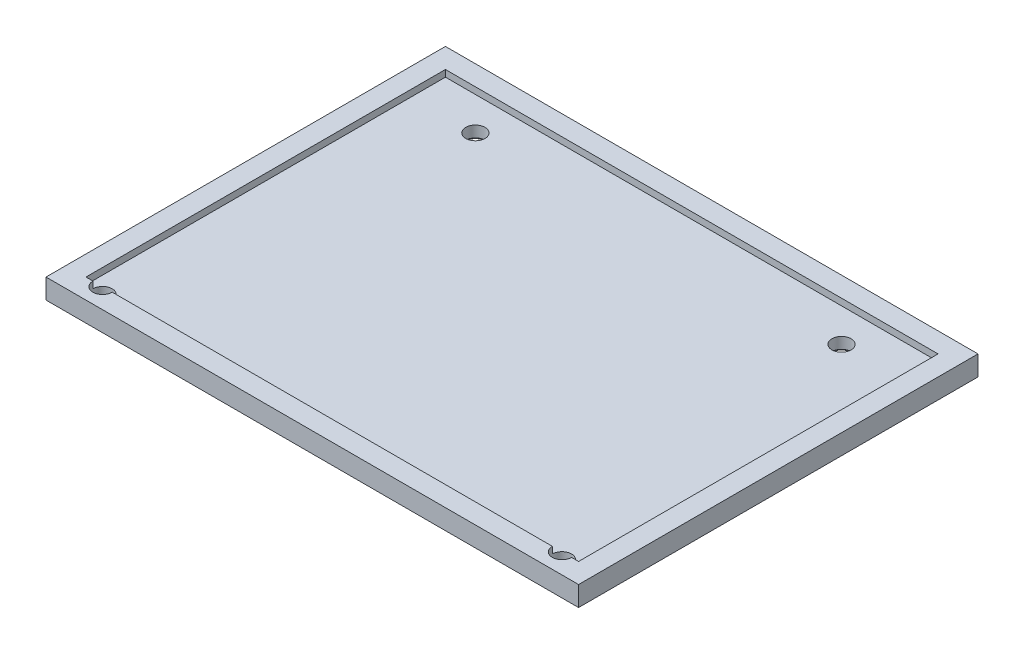
ISO-10303-21;
HEADER;
FILE_DESCRIPTION(('STEP AP214'),'2;1');
FILE_NAME('part.step','',(''),(''),'','','');
FILE_SCHEMA(('AUTOMOTIVE_DESIGN { 1 0 10303 214 1 1 1 1 }'));
ENDSEC;
DATA;
#1=APPLICATION_CONTEXT('core data for automotive mechanical design processes');
#2=APPLICATION_PROTOCOL_DEFINITION('international standard','automotive_design',2000,#1);
#3=PRODUCT_CONTEXT('',#1,'mechanical');
#4=PRODUCT('Part','Part','',(#3));
#5=PRODUCT_RELATED_PRODUCT_CATEGORY('part','',(#4));
#6=PRODUCT_DEFINITION_FORMATION('','',#4);
#7=PRODUCT_DEFINITION_CONTEXT('part definition',#1,'design');
#8=PRODUCT_DEFINITION('design','',#6,#7);
#9=PRODUCT_DEFINITION_SHAPE('','',#8);
#10=(LENGTH_UNIT() NAMED_UNIT(*) SI_UNIT(.MILLI.,.METRE.));
#11=(NAMED_UNIT(*) PLANE_ANGLE_UNIT() SI_UNIT($,.RADIAN.));
#12=(NAMED_UNIT(*) SI_UNIT($,.STERADIAN.) SOLID_ANGLE_UNIT());
#13=UNCERTAINTY_MEASURE_WITH_UNIT(LENGTH_MEASURE(1.E-05),#10,'distance_accuracy_value','');
#14=(GEOMETRIC_REPRESENTATION_CONTEXT(3) GLOBAL_UNCERTAINTY_ASSIGNED_CONTEXT((#13)) GLOBAL_UNIT_ASSIGNED_CONTEXT((#10,
#11,#12)) REPRESENTATION_CONTEXT('',''));
#15=CARTESIAN_POINT('',(0.,0.,0.));
#16=DIRECTION('',(0.,0.,1.));
#17=DIRECTION('',(1.,0.,0.));
#18=AXIS2_PLACEMENT_3D('',#15,#16,#17);
#19=CARTESIAN_POINT('',(0.,3.,-3.));
#20=DIRECTION('',(0.,0.,-1.));
#21=DIRECTION('',(-1.,0.,0.));
#22=AXIS2_PLACEMENT_3D('',#19,#20,#21);
#23=PLANE('',#22);
#24=DIRECTION('',(0.,-1.,0.));
#25=VECTOR('',#24,1.);
#26=CARTESIAN_POINT('',(75.95,0.,-3.));
#27=LINE('',#26,#25);
#28=CARTESIAN_POINT('',(75.95,3.,-3.));
#29=VERTEX_POINT('',#28);
#30=CARTESIAN_POINT('',(75.95,2.,-3.));
#31=VERTEX_POINT('',#30);
#32=EDGE_CURVE('E61',#29,#31,#27,.T.);
#33=ORIENTED_EDGE('',*,*,#32,.F.);
#34=DIRECTION('',(1.,0.,0.));
#35=VECTOR('',#34,1.);
#36=CARTESIAN_POINT('',(0.,3.,-3.));
#37=LINE('',#36,#35);
#38=CARTESIAN_POINT('',(77.,3.,-3.));
#39=VERTEX_POINT('',#38);
#40=EDGE_CURVE('E283',#29,#39,#37,.T.);
#41=ORIENTED_EDGE('',*,*,#40,.T.);
#42=DIRECTION('',(0.,-1.,0.));
#43=VECTOR('',#42,1.);
#44=CARTESIAN_POINT('',(77.,3.,-3.));
#45=LINE('',#44,#43);
#46=CARTESIAN_POINT('',(77.,2.,-3.));
#47=VERTEX_POINT('',#46);
#48=EDGE_CURVE('E177',#39,#47,#45,.T.);
#49=ORIENTED_EDGE('',*,*,#48,.T.);
#50=DIRECTION('',(1.,0.,0.));
#51=VECTOR('',#50,1.);
#52=CARTESIAN_POINT('',(0.,2.,-3.));
#53=LINE('',#52,#51);
#54=EDGE_CURVE('E154',#31,#47,#53,.T.);
#55=ORIENTED_EDGE('',*,*,#54,.F.);
#56=EDGE_LOOP('',(#33,#41,#49,#55));
#57=FACE_BOUND('',#56,.T.);
#58=ADVANCED_FACE('F45',(#57),#23,.T.);
#59=DIRECTION('',(0.,-1.,0.));
#60=VECTOR('',#59,1.);
#61=CARTESIAN_POINT('',(73.05,0.,-3.));
#62=LINE('',#61,#60);
#63=CARTESIAN_POINT('',(73.05,2.,-3.));
#64=VERTEX_POINT('',#63);
#65=CARTESIAN_POINT('',(73.05,3.,-3.));
#66=VERTEX_POINT('',#65);
#67=EDGE_CURVE('E134',#64,#66,#62,.F.);
#68=ORIENTED_EDGE('',*,*,#67,.F.);
#69=CARTESIAN_POINT('',(6.94999999999999,2.,-3.));
#70=VERTEX_POINT('',#69);
#71=EDGE_CURVE('E144',#70,#64,#53,.T.);
#72=ORIENTED_EDGE('',*,*,#71,.F.);
#73=DIRECTION('',(0.,-1.,0.));
#74=VECTOR('',#73,1.);
#75=CARTESIAN_POINT('',(6.94999999999999,0.,-3.));
#76=LINE('',#75,#74);
#77=CARTESIAN_POINT('',(6.94999999999999,3.,-3.));
#78=VERTEX_POINT('',#77);
#79=EDGE_CURVE('E54',#78,#70,#76,.T.);
#80=ORIENTED_EDGE('',*,*,#79,.F.);
#81=EDGE_CURVE('E146',#78,#66,#37,.T.);
#82=ORIENTED_EDGE('',*,*,#81,.T.);
#83=EDGE_LOOP('',(#68,#72,#80,#82));
#84=FACE_BOUND('',#83,.T.);
#85=ADVANCED_FACE('F142',(#84),#23,.T.);
#86=CARTESIAN_POINT('',(0.,2.,0.));
#87=DIRECTION('',(1.,0.,0.));
#88=DIRECTION('',(0.,0.,-1.));
#89=AXIS2_PLACEMENT_3D('',#86,#87,#88);
#90=PLANE('',#89);
#91=DIRECTION('',(0.,0.,1.));
#92=VECTOR('',#91,1.);
#93=CARTESIAN_POINT('',(0.,0.,0.));
#94=LINE('',#93,#92);
#95=CARTESIAN_POINT('',(0.,0.,-60.));
#96=VERTEX_POINT('',#95);
#97=CARTESIAN_POINT('',(0.,0.,0.));
#98=VERTEX_POINT('',#97);
#99=EDGE_CURVE('E184',#96,#98,#94,.T.);
#100=ORIENTED_EDGE('',*,*,#99,.T.);
#101=DIRECTION('',(0.,-1.,0.));
#102=VECTOR('',#101,1.);
#103=CARTESIAN_POINT('',(0.,2.,0.));
#104=LINE('',#103,#102);
#105=CARTESIAN_POINT('',(0.,3.,0.));
#106=VERTEX_POINT('',#105);
#107=EDGE_CURVE('E209',#106,#98,#104,.T.);
#108=ORIENTED_EDGE('',*,*,#107,.F.);
#109=DIRECTION('',(0.,0.,1.));
#110=VECTOR('',#109,1.);
#111=CARTESIAN_POINT('',(0.,3.,0.));
#112=LINE('',#111,#110);
#113=CARTESIAN_POINT('',(0.,3.,-60.));
#114=VERTEX_POINT('',#113);
#115=EDGE_CURVE('E264',#114,#106,#112,.T.);
#116=ORIENTED_EDGE('',*,*,#115,.F.);
#117=DIRECTION('',(0.,-1.,0.));
#118=VECTOR('',#117,1.);
#119=CARTESIAN_POINT('',(0.,2.,-60.));
#120=LINE('',#119,#118);
#121=EDGE_CURVE('E197',#114,#96,#120,.T.);
#122=ORIENTED_EDGE('',*,*,#121,.T.);
#123=EDGE_LOOP('',(#100,#108,#116,#122));
#124=FACE_BOUND('',#123,.T.);
#125=ADVANCED_FACE('F47',(#124),#90,.F.);
#126=CARTESIAN_POINT('',(0.,2.,0.));
#127=DIRECTION('',(0.,0.,-1.));
#128=DIRECTION('',(-1.,0.,0.));
#129=AXIS2_PLACEMENT_3D('',#126,#127,#128);
#130=PLANE('',#129);
#131=DIRECTION('',(1.,0.,0.));
#132=VECTOR('',#131,1.);
#133=CARTESIAN_POINT('',(0.,0.,0.));
#134=LINE('',#133,#132);
#135=CARTESIAN_POINT('',(80.,0.,0.));
#136=VERTEX_POINT('',#135);
#137=EDGE_CURVE('E188',#98,#136,#134,.T.);
#138=ORIENTED_EDGE('',*,*,#137,.T.);
#139=DIRECTION('',(0.,-1.,0.));
#140=VECTOR('',#139,1.);
#141=CARTESIAN_POINT('',(80.,2.,0.));
#142=LINE('',#141,#140);
#143=CARTESIAN_POINT('',(80.,3.,0.));
#144=VERTEX_POINT('',#143);
#145=EDGE_CURVE('E205',#144,#136,#142,.T.);
#146=ORIENTED_EDGE('',*,*,#145,.F.);
#147=DIRECTION('',(1.,0.,0.));
#148=VECTOR('',#147,1.);
#149=CARTESIAN_POINT('',(0.,3.,0.));
#150=LINE('',#149,#148);
#151=EDGE_CURVE('E267',#106,#144,#150,.T.);
#152=ORIENTED_EDGE('',*,*,#151,.F.);
#153=ORIENTED_EDGE('',*,*,#107,.T.);
#154=EDGE_LOOP('',(#138,#146,#152,#153));
#155=FACE_BOUND('',#154,.T.);
#156=ADVANCED_FACE('F529',(#155),#130,.F.);
#157=CARTESIAN_POINT('',(80.,2.,0.));
#158=DIRECTION('',(-1.,0.,0.));
#159=DIRECTION('',(0.,0.,1.));
#160=AXIS2_PLACEMENT_3D('',#157,#158,#159);
#161=PLANE('',#160);
#162=DIRECTION('',(0.,0.,-1.));
#163=VECTOR('',#162,1.);
#164=CARTESIAN_POINT('',(80.,0.,0.));
#165=LINE('',#164,#163);
#166=CARTESIAN_POINT('',(80.,0.,-60.));
#167=VERTEX_POINT('',#166);
#168=EDGE_CURVE('E191',#136,#167,#165,.T.);
#169=ORIENTED_EDGE('',*,*,#168,.T.);
#170=DIRECTION('',(0.,-1.,0.));
#171=VECTOR('',#170,1.);
#172=CARTESIAN_POINT('',(80.,2.,-60.));
#173=LINE('',#172,#171);
#174=CARTESIAN_POINT('',(80.,3.,-60.));
#175=VERTEX_POINT('',#174);
#176=EDGE_CURVE('E201',#175,#167,#173,.T.);
#177=ORIENTED_EDGE('',*,*,#176,.F.);
#178=DIRECTION('',(0.,0.,-1.));
#179=VECTOR('',#178,1.);
#180=CARTESIAN_POINT('',(80.,3.,0.));
#181=LINE('',#180,#179);
#182=EDGE_CURVE('E271',#144,#175,#181,.T.);
#183=ORIENTED_EDGE('',*,*,#182,.F.);
#184=ORIENTED_EDGE('',*,*,#145,.T.);
#185=EDGE_LOOP('',(#169,#177,#183,#184));
#186=FACE_BOUND('',#185,.T.);
#187=ADVANCED_FACE('F514',(#186),#161,.F.);
#188=CARTESIAN_POINT('',(0.,2.,-60.));
#189=DIRECTION('',(0.,0.,1.));
#190=DIRECTION('',(1.,0.,0.));
#191=AXIS2_PLACEMENT_3D('',#188,#189,#190);
#192=PLANE('',#191);
#193=DIRECTION('',(-1.,0.,0.));
#194=VECTOR('',#193,1.);
#195=CARTESIAN_POINT('',(0.,0.,-60.));
#196=LINE('',#195,#194);
#197=EDGE_CURVE('E194',#167,#96,#196,.T.);
#198=ORIENTED_EDGE('',*,*,#197,.T.);
#199=ORIENTED_EDGE('',*,*,#121,.F.);
#200=DIRECTION('',(-1.,0.,0.));
#201=VECTOR('',#200,1.);
#202=CARTESIAN_POINT('',(0.,3.,-60.));
#203=LINE('',#202,#201);
#204=EDGE_CURVE('E168',#175,#114,#203,.T.);
#205=ORIENTED_EDGE('',*,*,#204,.F.);
#206=ORIENTED_EDGE('',*,*,#176,.T.);
#207=EDGE_LOOP('',(#198,#199,#205,#206));
#208=FACE_BOUND('',#207,.T.);
#209=ADVANCED_FACE('F319',(#208),#192,.F.);
#210=CARTESIAN_POINT('',(0.,0.,0.));
#211=DIRECTION('',(0.,-1.,0.));
#212=DIRECTION('',(0.,0.,-1.));
#213=AXIS2_PLACEMENT_3D('',#210,#211,#212);
#214=PLANE('',#213);
#215=CARTESIAN_POINT('',(74.5,0.,-3.));
#216=DIRECTION('',(0.,-1.,0.));
#217=DIRECTION('',(0.,0.,-1.));
#218=AXIS2_PLACEMENT_3D('',#215,#216,#217);
#219=CIRCLE('',#218,1.775);
#220=CARTESIAN_POINT('',(74.5,0.,-4.775));
#221=VERTEX_POINT('',#220);
#222=EDGE_CURVE('E613',#221,#221,#219,.T.);
#223=ORIENTED_EDGE('',*,*,#222,.F.);
#224=EDGE_LOOP('',(#223));
#225=FACE_BOUND('',#224,.T.);
#226=CARTESIAN_POINT('',(12.5,0.,-52.));
#227=DIRECTION('',(0.,-1.,0.));
#228=DIRECTION('',(0.,0.,-1.));
#229=AXIS2_PLACEMENT_3D('',#226,#227,#228);
#230=CIRCLE('',#229,1.775);
#231=CARTESIAN_POINT('',(12.5,0.,-53.775));
#232=VERTEX_POINT('',#231);
#233=EDGE_CURVE('E237',#232,#232,#230,.T.);
#234=ORIENTED_EDGE('',*,*,#233,.F.);
#235=EDGE_LOOP('',(#234));
#236=FACE_BOUND('',#235,.T.);
#237=CARTESIAN_POINT('',(67.5,0.,-52.));
#238=DIRECTION('',(0.,-1.,0.));
#239=DIRECTION('',(0.,0.,-1.));
#240=AXIS2_PLACEMENT_3D('',#237,#238,#239);
#241=CIRCLE('',#240,1.775);
#242=CARTESIAN_POINT('',(67.5,0.,-53.775));
#243=VERTEX_POINT('',#242);
#244=EDGE_CURVE('E226',#243,#243,#241,.T.);
#245=ORIENTED_EDGE('',*,*,#244,.F.);
#246=EDGE_LOOP('',(#245));
#247=FACE_BOUND('',#246,.T.);
#248=CARTESIAN_POINT('',(5.5,0.,-3.));
#249=DIRECTION('',(0.,-1.,0.));
#250=DIRECTION('',(0.,0.,-1.));
#251=AXIS2_PLACEMENT_3D('',#248,#249,#250);
#252=CIRCLE('',#251,1.775);
#253=CARTESIAN_POINT('',(5.5,0.,-4.775));
#254=VERTEX_POINT('',#253);
#255=EDGE_CURVE('E221',#254,#254,#252,.T.);
#256=ORIENTED_EDGE('',*,*,#255,.F.);
#257=EDGE_LOOP('',(#256));
#258=FACE_BOUND('',#257,.T.);
#259=ORIENTED_EDGE('',*,*,#99,.F.);
#260=ORIENTED_EDGE('',*,*,#197,.F.);
#261=ORIENTED_EDGE('',*,*,#168,.F.);
#262=ORIENTED_EDGE('',*,*,#137,.F.);
#263=EDGE_LOOP('',(#259,#260,#261,#262));
#264=FACE_BOUND('',#263,.T.);
#265=ADVANCED_FACE('F311',(#225,#236,#247,#258,#264),#214,.T.);
#266=CARTESIAN_POINT('',(0.,3.,-57.));
#267=DIRECTION('',(0.,0.,-1.));
#268=DIRECTION('',(-1.,0.,0.));
#269=AXIS2_PLACEMENT_3D('',#266,#267,#268);
#270=PLANE('',#269);
#271=DIRECTION('',(1.,0.,0.));
#272=VECTOR('',#271,1.);
#273=CARTESIAN_POINT('',(0.,2.,-57.));
#274=LINE('',#273,#272);
#275=CARTESIAN_POINT('',(3.,2.,-57.));
#276=VERTEX_POINT('',#275);
#277=CARTESIAN_POINT('',(77.,2.,-57.));
#278=VERTEX_POINT('',#277);
#279=EDGE_CURVE('E260',#276,#278,#274,.T.);
#280=ORIENTED_EDGE('',*,*,#279,.T.);
#281=DIRECTION('',(0.,-1.,0.));
#282=VECTOR('',#281,1.);
#283=CARTESIAN_POINT('',(77.,3.,-57.));
#284=LINE('',#283,#282);
#285=CARTESIAN_POINT('',(77.,3.,-57.));
#286=VERTEX_POINT('',#285);
#287=EDGE_CURVE('E181',#286,#278,#284,.T.);
#288=ORIENTED_EDGE('',*,*,#287,.F.);
#289=DIRECTION('',(1.,0.,0.));
#290=VECTOR('',#289,1.);
#291=CARTESIAN_POINT('',(0.,3.,-57.));
#292=LINE('',#291,#290);
#293=CARTESIAN_POINT('',(3.,3.,-57.));
#294=VERTEX_POINT('',#293);
#295=EDGE_CURVE('E275',#294,#286,#292,.T.);
#296=ORIENTED_EDGE('',*,*,#295,.F.);
#297=DIRECTION('',(0.,-1.,0.));
#298=VECTOR('',#297,1.);
#299=CARTESIAN_POINT('',(3.,3.,-57.));
#300=LINE('',#299,#298);
#301=EDGE_CURVE('E169',#294,#276,#300,.T.);
#302=ORIENTED_EDGE('',*,*,#301,.T.);
#303=EDGE_LOOP('',(#280,#288,#296,#302));
#304=FACE_BOUND('',#303,.T.);
#305=ADVANCED_FACE('F309',(#304),#270,.F.);
#306=CARTESIAN_POINT('',(77.,3.,0.));
#307=DIRECTION('',(1.,0.,0.));
#308=DIRECTION('',(0.,0.,-1.));
#309=AXIS2_PLACEMENT_3D('',#306,#307,#308);
#310=PLANE('',#309);
#311=DIRECTION('',(0.,0.,1.));
#312=VECTOR('',#311,1.);
#313=CARTESIAN_POINT('',(77.,2.,0.));
#314=LINE('',#313,#312);
#315=EDGE_CURVE('E161',#278,#47,#314,.T.);
#316=ORIENTED_EDGE('',*,*,#315,.T.);
#317=ORIENTED_EDGE('',*,*,#48,.F.);
#318=DIRECTION('',(0.,0.,1.));
#319=VECTOR('',#318,1.);
#320=CARTESIAN_POINT('',(77.,3.,0.));
#321=LINE('',#320,#319);
#322=EDGE_CURVE('E279',#286,#39,#321,.T.);
#323=ORIENTED_EDGE('',*,*,#322,.F.);
#324=ORIENTED_EDGE('',*,*,#287,.T.);
#325=EDGE_LOOP('',(#316,#317,#323,#324));
#326=FACE_BOUND('',#325,.T.);
#327=ADVANCED_FACE('F299',(#326),#310,.F.);
#328=DIRECTION('',(0.,-1.,0.));
#329=VECTOR('',#328,1.);
#330=CARTESIAN_POINT('',(4.05000000000001,0.,-3.));
#331=LINE('',#330,#329);
#332=CARTESIAN_POINT('',(4.05000000000001,2.,-3.));
#333=VERTEX_POINT('',#332);
#334=CARTESIAN_POINT('',(4.05000000000001,3.,-3.));
#335=VERTEX_POINT('',#334);
#336=EDGE_CURVE('E213',#333,#335,#331,.F.);
#337=ORIENTED_EDGE('',*,*,#336,.F.);
#338=CARTESIAN_POINT('',(3.,2.,-3.));
#339=VERTEX_POINT('',#338);
#340=EDGE_CURVE('E153',#339,#333,#53,.T.);
#341=ORIENTED_EDGE('',*,*,#340,.F.);
#342=DIRECTION('',(0.,-1.,0.));
#343=VECTOR('',#342,1.);
#344=CARTESIAN_POINT('',(3.,3.,-3.));
#345=LINE('',#344,#343);
#346=CARTESIAN_POINT('',(3.,3.,-3.));
#347=VERTEX_POINT('',#346);
#348=EDGE_CURVE('E172',#347,#339,#345,.T.);
#349=ORIENTED_EDGE('',*,*,#348,.F.);
#350=EDGE_CURVE('E284',#347,#335,#37,.T.);
#351=ORIENTED_EDGE('',*,*,#350,.T.);
#352=EDGE_LOOP('',(#337,#341,#349,#351));
#353=FACE_BOUND('',#352,.T.);
#354=ADVANCED_FACE('F317',(#353),#23,.T.);
#355=CARTESIAN_POINT('',(3.,3.,0.));
#356=DIRECTION('',(1.,0.,0.));
#357=DIRECTION('',(0.,0.,-1.));
#358=AXIS2_PLACEMENT_3D('',#355,#356,#357);
#359=PLANE('',#358);
#360=DIRECTION('',(0.,0.,1.));
#361=VECTOR('',#360,1.);
#362=CARTESIAN_POINT('',(3.,2.,0.));
#363=LINE('',#362,#361);
#364=EDGE_CURVE('E159',#276,#339,#363,.T.);
#365=ORIENTED_EDGE('',*,*,#364,.F.);
#366=ORIENTED_EDGE('',*,*,#301,.F.);
#367=DIRECTION('',(0.,0.,1.));
#368=VECTOR('',#367,1.);
#369=CARTESIAN_POINT('',(3.,3.,0.));
#370=LINE('',#369,#368);
#371=EDGE_CURVE('E173',#294,#347,#370,.T.);
#372=ORIENTED_EDGE('',*,*,#371,.T.);
#373=ORIENTED_EDGE('',*,*,#348,.T.);
#374=EDGE_LOOP('',(#365,#366,#372,#373));
#375=FACE_BOUND('',#374,.T.);
#376=ADVANCED_FACE('F330',(#375),#359,.T.);
#377=CARTESIAN_POINT('',(0.,3.,0.));
#378=DIRECTION('',(0.,1.,0.));
#379=DIRECTION('',(0.,0.,1.));
#380=AXIS2_PLACEMENT_3D('',#377,#378,#379);
#381=PLANE('',#380);
#382=CARTESIAN_POINT('',(74.5,3.,-3.));
#383=DIRECTION('',(0.,1.,0.));
#384=DIRECTION('',(0.,0.,1.));
#385=AXIS2_PLACEMENT_3D('',#382,#383,#384);
#386=CIRCLE('',#385,1.44999999999999);
#387=EDGE_CURVE('E243',#66,#29,#386,.T.);
#388=ORIENTED_EDGE('',*,*,#387,.F.);
#389=ORIENTED_EDGE('',*,*,#81,.F.);
#390=CARTESIAN_POINT('',(5.5,3.,-3.));
#391=DIRECTION('',(0.,1.,0.));
#392=DIRECTION('',(0.,0.,1.));
#393=AXIS2_PLACEMENT_3D('',#390,#391,#392);
#394=CIRCLE('',#393,1.44999999999999);
#395=EDGE_CURVE('E256',#335,#78,#394,.T.);
#396=ORIENTED_EDGE('',*,*,#395,.F.);
#397=ORIENTED_EDGE('',*,*,#350,.F.);
#398=ORIENTED_EDGE('',*,*,#371,.F.);
#399=ORIENTED_EDGE('',*,*,#295,.T.);
#400=ORIENTED_EDGE('',*,*,#322,.T.);
#401=ORIENTED_EDGE('',*,*,#40,.F.);
#402=EDGE_LOOP('',(#388,#389,#396,#397,#398,#399,#400,#401));
#403=FACE_BOUND('',#402,.T.);
#404=ORIENTED_EDGE('',*,*,#204,.T.);
#405=ORIENTED_EDGE('',*,*,#115,.T.);
#406=ORIENTED_EDGE('',*,*,#151,.T.);
#407=ORIENTED_EDGE('',*,*,#182,.T.);
#408=EDGE_LOOP('',(#404,#405,#406,#407));
#409=FACE_BOUND('',#408,.T.);
#410=ADVANCED_FACE('F304',(#403,#409),#381,.T.);
#411=CARTESIAN_POINT('',(0.,2.,0.));
#412=DIRECTION('',(0.,-1.,0.));
#413=DIRECTION('',(0.,0.,-1.));
#414=AXIS2_PLACEMENT_3D('',#411,#412,#413);
#415=PLANE('',#414);
#416=CARTESIAN_POINT('',(12.5,2.,-52.));
#417=DIRECTION('',(0.,-1.,0.));
#418=DIRECTION('',(0.,0.,-1.));
#419=AXIS2_PLACEMENT_3D('',#416,#417,#418);
#420=CIRCLE('',#419,1.44999999999999);
#421=CARTESIAN_POINT('',(12.5,2.,-53.45));
#422=VERTEX_POINT('',#421);
#423=EDGE_CURVE('E223',#422,#422,#420,.T.);
#424=ORIENTED_EDGE('',*,*,#423,.T.);
#425=EDGE_LOOP('',(#424));
#426=FACE_BOUND('',#425,.T.);
#427=CARTESIAN_POINT('',(67.5,2.,-52.));
#428=DIRECTION('',(0.,-1.,0.));
#429=DIRECTION('',(0.,0.,-1.));
#430=AXIS2_PLACEMENT_3D('',#427,#428,#429);
#431=CIRCLE('',#430,1.44999999999999);
#432=CARTESIAN_POINT('',(67.5,2.,-53.45));
#433=VERTEX_POINT('',#432);
#434=EDGE_CURVE('E218',#433,#433,#431,.T.);
#435=ORIENTED_EDGE('',*,*,#434,.T.);
#436=EDGE_LOOP('',(#435));
#437=FACE_BOUND('',#436,.T.);
#438=ORIENTED_EDGE('',*,*,#71,.T.);
#439=CARTESIAN_POINT('',(74.5,2.,-3.));
#440=DIRECTION('',(0.,-1.,0.));
#441=DIRECTION('',(0.,0.,-1.));
#442=AXIS2_PLACEMENT_3D('',#439,#440,#441);
#443=CIRCLE('',#442,1.44999999999999);
#444=EDGE_CURVE('E11',#64,#31,#443,.T.);
#445=ORIENTED_EDGE('',*,*,#444,.T.);
#446=ORIENTED_EDGE('',*,*,#54,.T.);
#447=ORIENTED_EDGE('',*,*,#315,.F.);
#448=ORIENTED_EDGE('',*,*,#279,.F.);
#449=ORIENTED_EDGE('',*,*,#364,.T.);
#450=ORIENTED_EDGE('',*,*,#340,.T.);
#451=CARTESIAN_POINT('',(5.5,2.,-3.));
#452=DIRECTION('',(0.,-1.,0.));
#453=DIRECTION('',(0.,0.,-1.));
#454=AXIS2_PLACEMENT_3D('',#451,#452,#453);
#455=CIRCLE('',#454,1.44999999999999);
#456=EDGE_CURVE('E68',#333,#70,#455,.T.);
#457=ORIENTED_EDGE('',*,*,#456,.T.);
#458=EDGE_LOOP('',(#438,#445,#446,#447,#448,#449,#450,#457));
#459=FACE_BOUND('',#458,.T.);
#460=ADVANCED_FACE('F150',(#426,#437,#459),#415,.F.);
#461=CARTESIAN_POINT('',(5.5,0.,-3.));
#462=DIRECTION('',(0.,-1.,0.));
#463=DIRECTION('',(0.,0.,-1.));
#464=AXIS2_PLACEMENT_3D('',#461,#462,#463);
#465=CYLINDRICAL_SURFACE('',#464,1.44999999999999);
#466=CARTESIAN_POINT('',(5.5,0.325000000000001,-3.));
#467=DIRECTION('',(0.,-1.,0.));
#468=DIRECTION('',(0.,0.,-1.));
#469=AXIS2_PLACEMENT_3D('',#466,#467,#468);
#470=CIRCLE('',#469,1.45);
#471=CARTESIAN_POINT('',(5.5,0.325000000000001,-4.45));
#472=VERTEX_POINT('',#471);
#473=EDGE_CURVE('E252',#472,#472,#470,.T.);
#474=ORIENTED_EDGE('',*,*,#473,.T.);
#475=EDGE_LOOP('',(#474));
#476=FACE_BOUND('',#475,.T.);
#477=ORIENTED_EDGE('',*,*,#336,.T.);
#478=ORIENTED_EDGE('',*,*,#395,.T.);
#479=ORIENTED_EDGE('',*,*,#79,.T.);
#480=ORIENTED_EDGE('',*,*,#456,.F.);
#481=EDGE_LOOP('',(#477,#478,#479,#480));
#482=FACE_BOUND('',#481,.T.);
#483=ADVANCED_FACE('F338',(#476,#482),#465,.F.);
#484=CARTESIAN_POINT('',(5.5,0.,-3.));
#485=DIRECTION('',(0.,-1.,0.));
#486=DIRECTION('',(0.,0.,-1.));
#487=AXIS2_PLACEMENT_3D('',#484,#485,#486);
#488=CONICAL_SURFACE('',#487,1.775,0.785398163397447);
#489=ORIENTED_EDGE('',*,*,#473,.F.);
#490=EDGE_LOOP('',(#489));
#491=FACE_BOUND('',#490,.T.);
#492=ORIENTED_EDGE('',*,*,#255,.T.);
#493=EDGE_LOOP('',(#492));
#494=FACE_BOUND('',#493,.T.);
#495=ADVANCED_FACE('F340',(#491,#494),#488,.F.);
#496=CARTESIAN_POINT('',(67.5,0.,-52.));
#497=DIRECTION('',(0.,-1.,0.));
#498=DIRECTION('',(0.,0.,-1.));
#499=AXIS2_PLACEMENT_3D('',#496,#497,#498);
#500=CYLINDRICAL_SURFACE('',#499,1.44999999999999);
#501=CARTESIAN_POINT('',(67.5,0.325000000000001,-52.));
#502=DIRECTION('',(0.,-1.,0.));
#503=DIRECTION('',(0.,0.,-1.));
#504=AXIS2_PLACEMENT_3D('',#501,#502,#503);
#505=CIRCLE('',#504,1.44999999999999);
#506=CARTESIAN_POINT('',(67.5,0.325000000000001,-53.45));
#507=VERTEX_POINT('',#506);
#508=EDGE_CURVE('E222',#507,#507,#505,.T.);
#509=ORIENTED_EDGE('',*,*,#508,.T.);
#510=EDGE_LOOP('',(#509));
#511=FACE_BOUND('',#510,.T.);
#512=ORIENTED_EDGE('',*,*,#434,.F.);
#513=EDGE_LOOP('',(#512));
#514=FACE_BOUND('',#513,.T.);
#515=ADVANCED_FACE('F347',(#511,#514),#500,.F.);
#516=CARTESIAN_POINT('',(67.5,0.,-52.));
#517=DIRECTION('',(0.,-1.,0.));
#518=DIRECTION('',(0.,0.,-1.));
#519=AXIS2_PLACEMENT_3D('',#516,#517,#518);
#520=CONICAL_SURFACE('',#519,1.775,0.785398163397454);
#521=ORIENTED_EDGE('',*,*,#508,.F.);
#522=EDGE_LOOP('',(#521));
#523=FACE_BOUND('',#522,.T.);
#524=ORIENTED_EDGE('',*,*,#244,.T.);
#525=EDGE_LOOP('',(#524));
#526=FACE_BOUND('',#525,.T.);
#527=ADVANCED_FACE('F376',(#523,#526),#520,.F.);
#528=CARTESIAN_POINT('',(12.5,0.,-52.));
#529=DIRECTION('',(0.,-1.,0.));
#530=DIRECTION('',(0.,0.,-1.));
#531=AXIS2_PLACEMENT_3D('',#528,#529,#530);
#532=CYLINDRICAL_SURFACE('',#531,1.44999999999999);
#533=CARTESIAN_POINT('',(12.5,0.325000000000001,-52.));
#534=DIRECTION('',(0.,-1.,0.));
#535=DIRECTION('',(0.,0.,-1.));
#536=AXIS2_PLACEMENT_3D('',#533,#534,#535);
#537=CIRCLE('',#536,1.45);
#538=CARTESIAN_POINT('',(12.5,0.325000000000001,-53.45));
#539=VERTEX_POINT('',#538);
#540=EDGE_CURVE('E227',#539,#539,#537,.T.);
#541=ORIENTED_EDGE('',*,*,#540,.T.);
#542=EDGE_LOOP('',(#541));
#543=FACE_BOUND('',#542,.T.);
#544=ORIENTED_EDGE('',*,*,#423,.F.);
#545=EDGE_LOOP('',(#544));
#546=FACE_BOUND('',#545,.T.);
#547=ADVANCED_FACE('F384',(#543,#546),#532,.F.);
#548=CARTESIAN_POINT('',(12.5,0.,-52.));
#549=DIRECTION('',(0.,-1.,0.));
#550=DIRECTION('',(0.,0.,-1.));
#551=AXIS2_PLACEMENT_3D('',#548,#549,#550);
#552=CONICAL_SURFACE('',#551,1.775,0.785398163397448);
#553=ORIENTED_EDGE('',*,*,#540,.F.);
#554=EDGE_LOOP('',(#553));
#555=FACE_BOUND('',#554,.T.);
#556=ORIENTED_EDGE('',*,*,#233,.T.);
#557=EDGE_LOOP('',(#556));
#558=FACE_BOUND('',#557,.T.);
#559=ADVANCED_FACE('F393',(#555,#558),#552,.F.);
#560=CARTESIAN_POINT('',(74.5,0.,-3.));
#561=DIRECTION('',(0.,-1.,0.));
#562=DIRECTION('',(0.,0.,-1.));
#563=AXIS2_PLACEMENT_3D('',#560,#561,#562);
#564=CYLINDRICAL_SURFACE('',#563,1.44999999999999);
#565=ORIENTED_EDGE('',*,*,#387,.T.);
#566=ORIENTED_EDGE('',*,*,#32,.T.);
#567=ORIENTED_EDGE('',*,*,#444,.F.);
#568=ORIENTED_EDGE('',*,*,#67,.T.);
#569=EDGE_LOOP('',(#565,#566,#567,#568));
#570=FACE_BOUND('',#569,.T.);
#571=CARTESIAN_POINT('',(74.5,0.325000000000001,-3.));
#572=DIRECTION('',(0.,-1.,0.));
#573=DIRECTION('',(0.,0.,-1.));
#574=AXIS2_PLACEMENT_3D('',#571,#572,#573);
#575=CIRCLE('',#574,1.44999999999999);
#576=CARTESIAN_POINT('',(74.5,0.325000000000001,-4.44999999999999));
#577=VERTEX_POINT('',#576);
#578=EDGE_CURVE('E148',#577,#577,#575,.T.);
#579=ORIENTED_EDGE('',*,*,#578,.T.);
#580=EDGE_LOOP('',(#579));
#581=FACE_BOUND('',#580,.T.);
#582=ADVANCED_FACE('F132',(#570,#581),#564,.F.);
#583=CARTESIAN_POINT('',(74.5,0.,-3.));
#584=DIRECTION('',(0.,-1.,0.));
#585=DIRECTION('',(0.,0.,-1.));
#586=AXIS2_PLACEMENT_3D('',#583,#584,#585);
#587=CONICAL_SURFACE('',#586,1.775,0.785398163397454);
#588=ORIENTED_EDGE('',*,*,#578,.F.);
#589=EDGE_LOOP('',(#588));
#590=FACE_BOUND('',#589,.T.);
#591=ORIENTED_EDGE('',*,*,#222,.T.);
#592=EDGE_LOOP('',(#591));
#593=FACE_BOUND('',#592,.T.);
#594=ADVANCED_FACE('F409',(#590,#593),#587,.F.);
#595=CLOSED_SHELL('',(#58,#85,#125,#156,#187,#209,#265,#305,#327,#354,#376,#410,#460,#483,#495,
#515,#527,#547,#559,#582,#594));
#596=MANIFOLD_SOLID_BREP('B2',#595);
#597=ADVANCED_BREP_SHAPE_REPRESENTATION('',(#18,#596),#14);
#598=SHAPE_DEFINITION_REPRESENTATION(#9,#597);
ENDSEC;
END-ISO-10303-21;
